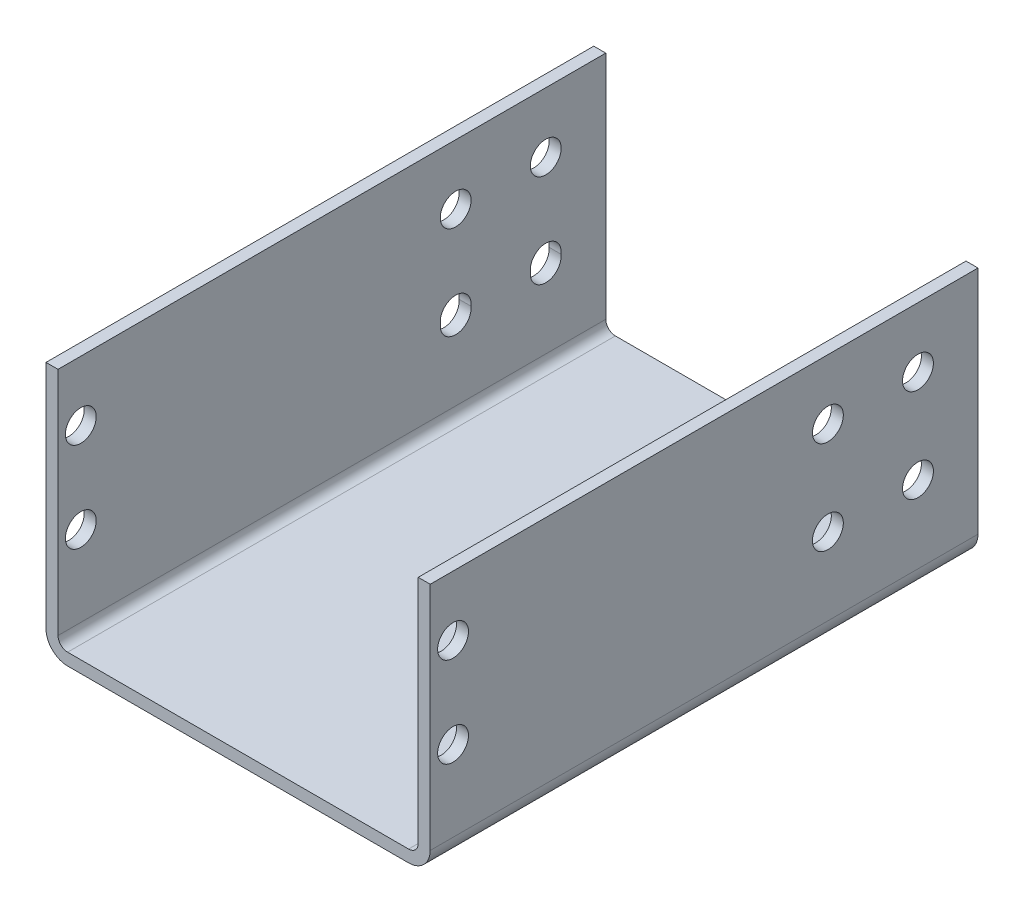
ISO-10303-21;
HEADER;
FILE_DESCRIPTION(('STEP AP214'),'2;1');
FILE_NAME('part.step','',(''),(''),'','','');
FILE_SCHEMA(('AUTOMOTIVE_DESIGN { 1 0 10303 214 1 1 1 1 }'));
ENDSEC;
DATA;
#1=APPLICATION_CONTEXT('core data for automotive mechanical design processes');
#2=APPLICATION_PROTOCOL_DEFINITION('international standard','automotive_design',2000,#1);
#3=PRODUCT_CONTEXT('',#1,'mechanical');
#4=PRODUCT('Part','Part','',(#3));
#5=PRODUCT_RELATED_PRODUCT_CATEGORY('part','',(#4));
#6=PRODUCT_DEFINITION_FORMATION('','',#4);
#7=PRODUCT_DEFINITION_CONTEXT('part definition',#1,'design');
#8=PRODUCT_DEFINITION('design','',#6,#7);
#9=PRODUCT_DEFINITION_SHAPE('','',#8);
#10=(LENGTH_UNIT() NAMED_UNIT(*) SI_UNIT(.MILLI.,.METRE.));
#11=(NAMED_UNIT(*) PLANE_ANGLE_UNIT() SI_UNIT($,.RADIAN.));
#12=(NAMED_UNIT(*) SI_UNIT($,.STERADIAN.) SOLID_ANGLE_UNIT());
#13=UNCERTAINTY_MEASURE_WITH_UNIT(LENGTH_MEASURE(1.E-05),#10,'distance_accuracy_value','');
#14=(GEOMETRIC_REPRESENTATION_CONTEXT(3) GLOBAL_UNCERTAINTY_ASSIGNED_CONTEXT((#13)) GLOBAL_UNIT_ASSIGNED_CONTEXT((#10,
#11,#12)) REPRESENTATION_CONTEXT('',''));
#15=CARTESIAN_POINT('',(0.,0.,0.));
#16=DIRECTION('',(0.,0.,1.));
#17=DIRECTION('',(1.,0.,0.));
#18=AXIS2_PLACEMENT_3D('',#15,#16,#17);
#19=CARTESIAN_POINT('',(-1.27,1.01600000000001,106.545154358872));
#20=DIRECTION('',(1.,0.,0.));
#21=DIRECTION('',(0.,0.,-1.));
#22=AXIS2_PLACEMENT_3D('',#19,#20,#21);
#23=PLANE('',#22);
#24=CARTESIAN_POINT('',(-1.27,19.0500000000006,55.5224999680006));
#25=DIRECTION('',(-1.,0.,0.));
#26=DIRECTION('',(0.,0.,1.));
#27=AXIS2_PLACEMENT_3D('',#24,#25,#26);
#28=CIRCLE('',#27,1.63194999999999);
#29=CARTESIAN_POINT('',(-1.27,19.0500000000006,57.1544499680006));
#30=VERTEX_POINT('',#29);
#31=EDGE_CURVE('E452',#30,#30,#28,.T.);
#32=ORIENTED_EDGE('',*,*,#31,.F.);
#33=EDGE_LOOP('',(#32));
#34=FACE_BOUND('',#33,.T.);
#35=CARTESIAN_POINT('',(-1.27,19.0500000000005,6.35000000000055));
#36=DIRECTION('',(-1.,0.,0.));
#37=DIRECTION('',(0.,0.,1.));
#38=AXIS2_PLACEMENT_3D('',#35,#36,#37);
#39=CIRCLE('',#38,1.63194999999999);
#40=CARTESIAN_POINT('',(-1.27,19.0500000000005,7.98195000000054));
#41=VERTEX_POINT('',#40);
#42=EDGE_CURVE('E285',#41,#41,#39,.T.);
#43=ORIENTED_EDGE('',*,*,#42,.F.);
#44=EDGE_LOOP('',(#43));
#45=FACE_BOUND('',#44,.T.);
#46=CARTESIAN_POINT('',(-1.27,19.0499999999993,15.8750000000001));
#47=DIRECTION('',(-1.,0.,0.));
#48=DIRECTION('',(0.,0.,1.));
#49=AXIS2_PLACEMENT_3D('',#46,#47,#48);
#50=CIRCLE('',#49,1.63194999999999);
#51=CARTESIAN_POINT('',(-1.27,19.0499999999993,17.50695));
#52=VERTEX_POINT('',#51);
#53=EDGE_CURVE('E166',#52,#52,#50,.T.);
#54=ORIENTED_EDGE('',*,*,#53,.F.);
#55=EDGE_LOOP('',(#54));
#56=FACE_BOUND('',#55,.T.);
#57=CARTESIAN_POINT('',(-1.27,9.52499999999934,15.8750000000002));
#58=DIRECTION('',(-1.,0.,0.));
#59=DIRECTION('',(0.,0.,1.));
#60=AXIS2_PLACEMENT_3D('',#57,#58,#59);
#61=CIRCLE('',#60,1.63194999999999);
#62=CARTESIAN_POINT('',(-1.27,9.34786065421082,17.4973077558448));
#63=VERTEX_POINT('',#62);
#64=CARTESIAN_POINT('',(-1.27,9.34786065421743,14.2526922441549));
#65=VERTEX_POINT('',#64);
#66=EDGE_CURVE('E156',#63,#65,#61,.T.);
#67=ORIENTED_EDGE('',*,*,#66,.F.);
#68=CARTESIAN_POINT('',(-1.27,9.17072130842898,15.8749999999995));
#69=DIRECTION('',(1.,0.,0.));
#70=DIRECTION('',(0.,0.,-1.));
#71=AXIS2_PLACEMENT_3D('',#68,#69,#70);
#72=CIRCLE('',#71,1.63194999999998);
#73=EDGE_CURVE('E146',#63,#65,#72,.T.);
#74=ORIENTED_EDGE('',*,*,#73,.T.);
#75=EDGE_LOOP('',(#67,#74));
#76=FACE_BOUND('',#75,.T.);
#77=CARTESIAN_POINT('',(-1.27,9.52499999999921,6.35000000000019));
#78=DIRECTION('',(-1.,0.,0.));
#79=DIRECTION('',(0.,0.,1.));
#80=AXIS2_PLACEMENT_3D('',#77,#78,#79);
#81=CIRCLE('',#80,1.63194999999999);
#82=CARTESIAN_POINT('',(-1.27,9.34786065421074,7.97230775584481));
#83=VERTEX_POINT('',#82);
#84=CARTESIAN_POINT('',(-1.27,9.34786065421736,4.72769224415485));
#85=VERTEX_POINT('',#84);
#86=EDGE_CURVE('E163',#83,#85,#81,.T.);
#87=ORIENTED_EDGE('',*,*,#86,.F.);
#88=CARTESIAN_POINT('',(-1.27,9.17072130842898,6.34999999999947));
#89=DIRECTION('',(1.,0.,0.));
#90=DIRECTION('',(0.,0.,-1.));
#91=AXIS2_PLACEMENT_3D('',#88,#89,#90);
#92=CIRCLE('',#91,1.63194999999998);
#93=EDGE_CURVE('E273',#83,#85,#92,.T.);
#94=ORIENTED_EDGE('',*,*,#93,.T.);
#95=EDGE_LOOP('',(#87,#94));
#96=FACE_BOUND('',#95,.T.);
#97=DIRECTION('',(0.,0.,-1.));
#98=VECTOR('',#97,1.);
#99=CARTESIAN_POINT('',(-1.27,1.01600000000002,106.545154358872));
#100=LINE('',#99,#98);
#101=CARTESIAN_POINT('',(-1.27,1.016,57.9354999680001));
#102=VERTEX_POINT('',#101);
#103=CARTESIAN_POINT('',(-1.27,1.01600000000002,0.));
#104=VERTEX_POINT('',#103);
#105=EDGE_CURVE('E245',#102,#104,#100,.T.);
#106=ORIENTED_EDGE('',*,*,#105,.F.);
#107=DIRECTION('',(0.,1.,0.));
#108=VECTOR('',#107,1.);
#109=CARTESIAN_POINT('',(-1.27,1.01599999999996,57.9354999680001));
#110=LINE('',#109,#108);
#111=CARTESIAN_POINT('',(-1.27,25.4,57.935499968));
#112=VERTEX_POINT('',#111);
#113=EDGE_CURVE('E183',#102,#112,#110,.T.);
#114=ORIENTED_EDGE('',*,*,#113,.T.);
#115=DIRECTION('',(0.,0.,-1.));
#116=VECTOR('',#115,1.);
#117=CARTESIAN_POINT('',(-1.27,25.4,106.545154358872));
#118=LINE('',#117,#116);
#119=CARTESIAN_POINT('',(-1.27,25.4,0.));
#120=VERTEX_POINT('',#119);
#121=EDGE_CURVE('E247',#112,#120,#118,.T.);
#122=ORIENTED_EDGE('',*,*,#121,.T.);
#123=DIRECTION('',(0.,1.,0.));
#124=VECTOR('',#123,1.);
#125=CARTESIAN_POINT('',(-1.27,1.01600000000001,0.));
#126=LINE('',#125,#124);
#127=EDGE_CURVE('E227',#120,#104,#126,.F.);
#128=ORIENTED_EDGE('',*,*,#127,.T.);
#129=EDGE_LOOP('',(#106,#114,#122,#128));
#130=FACE_BOUND('',#129,.T.);
#131=CARTESIAN_POINT('',(-1.27,9.52499999999995,55.5224999680002));
#132=DIRECTION('',(-1.,0.,0.));
#133=DIRECTION('',(0.,0.,1.));
#134=AXIS2_PLACEMENT_3D('',#131,#132,#133);
#135=CIRCLE('',#134,1.63194999999999);
#136=CARTESIAN_POINT('',(-1.27,9.52499999999995,57.1544499680002));
#137=VERTEX_POINT('',#136);
#138=EDGE_CURVE('E458',#137,#137,#135,.T.);
#139=ORIENTED_EDGE('',*,*,#138,.F.);
#140=EDGE_LOOP('',(#139));
#141=FACE_BOUND('',#140,.T.);
#142=ADVANCED_FACE('F33',(#34,#45,#56,#76,#96,#130,#141),#23,.F.);
#143=CARTESIAN_POINT('',(39.37,1.01600000000001,106.545154358872));
#144=DIRECTION('',(-1.,0.,0.));
#145=DIRECTION('',(0.,-1.,0.));
#146=AXIS2_PLACEMENT_3D('',#143,#144,#145);
#147=PLANE('',#146);
#148=CARTESIAN_POINT('',(39.3700000000009,9.52500000000058,55.5224999680002));
#149=DIRECTION('',(1.,0.,0.));
#150=DIRECTION('',(0.,0.,-1.));
#151=AXIS2_PLACEMENT_3D('',#148,#149,#150);
#152=CIRCLE('',#151,1.63194999999999);
#153=CARTESIAN_POINT('',(39.3700000000009,9.52500000000058,53.8905499680002));
#154=VERTEX_POINT('',#153);
#155=EDGE_CURVE('E442',#154,#154,#152,.T.);
#156=ORIENTED_EDGE('',*,*,#155,.F.);
#157=EDGE_LOOP('',(#156));
#158=FACE_BOUND('',#157,.T.);
#159=CARTESIAN_POINT('',(39.3700000000009,19.0500000000006,55.5224999679997));
#160=DIRECTION('',(1.,0.,0.));
#161=DIRECTION('',(0.,0.,-1.));
#162=AXIS2_PLACEMENT_3D('',#159,#160,#161);
#163=CIRCLE('',#162,1.63194999999999);
#164=CARTESIAN_POINT('',(39.3700000000009,19.0500000000006,53.8905499679997));
#165=VERTEX_POINT('',#164);
#166=EDGE_CURVE('E444',#165,#165,#163,.T.);
#167=ORIENTED_EDGE('',*,*,#166,.F.);
#168=EDGE_LOOP('',(#167));
#169=FACE_BOUND('',#168,.T.);
#170=CARTESIAN_POINT('',(39.3700000000009,19.0500000000006,6.34999999999947));
#171=DIRECTION('',(1.,0.,0.));
#172=DIRECTION('',(0.,0.,-1.));
#173=AXIS2_PLACEMENT_3D('',#170,#171,#172);
#174=CIRCLE('',#173,1.63194999999999);
#175=CARTESIAN_POINT('',(39.3700000000009,19.0500000000006,4.71804999999948));
#176=VERTEX_POINT('',#175);
#177=EDGE_CURVE('E464',#176,#176,#174,.T.);
#178=ORIENTED_EDGE('',*,*,#177,.F.);
#179=EDGE_LOOP('',(#178));
#180=FACE_BOUND('',#179,.T.);
#181=CARTESIAN_POINT('',(39.3700000000009,19.0500000000006,15.8749999999995));
#182=DIRECTION('',(1.,0.,0.));
#183=DIRECTION('',(0.,0.,-1.));
#184=AXIS2_PLACEMENT_3D('',#181,#182,#183);
#185=CIRCLE('',#184,1.63194999999999);
#186=CARTESIAN_POINT('',(39.3700000000009,19.0500000000006,14.2430499999995));
#187=VERTEX_POINT('',#186);
#188=EDGE_CURVE('E470',#187,#187,#185,.T.);
#189=ORIENTED_EDGE('',*,*,#188,.F.);
#190=EDGE_LOOP('',(#189));
#191=FACE_BOUND('',#190,.T.);
#192=CARTESIAN_POINT('',(39.3700000000009,9.17072130842898,15.8749999999995));
#193=DIRECTION('',(1.,0.,0.));
#194=DIRECTION('',(0.,0.,-1.));
#195=AXIS2_PLACEMENT_3D('',#192,#193,#194);
#196=CIRCLE('',#195,1.63194999999999);
#197=CARTESIAN_POINT('',(39.3700000000009,9.17072130842898,14.2430499999995));
#198=VERTEX_POINT('',#197);
#199=EDGE_CURVE('E157',#198,#198,#196,.T.);
#200=ORIENTED_EDGE('',*,*,#199,.F.);
#201=EDGE_LOOP('',(#200));
#202=FACE_BOUND('',#201,.T.);
#203=DIRECTION('',(0.,0.,-1.));
#204=VECTOR('',#203,1.);
#205=CARTESIAN_POINT('',(39.37,25.4,106.545154358872));
#206=LINE('',#205,#204);
#207=CARTESIAN_POINT('',(39.37,25.4,57.935499968));
#208=VERTEX_POINT('',#207);
#209=CARTESIAN_POINT('',(39.37,25.4,0.));
#210=VERTEX_POINT('',#209);
#211=EDGE_CURVE('E261',#208,#210,#206,.T.);
#212=ORIENTED_EDGE('',*,*,#211,.F.);
#213=DIRECTION('',(0.,-1.,0.));
#214=VECTOR('',#213,1.);
#215=CARTESIAN_POINT('',(39.37,1.01599999999996,57.935499968));
#216=LINE('',#215,#214);
#217=CARTESIAN_POINT('',(39.37,1.01600000000001,57.935499968));
#218=VERTEX_POINT('',#217);
#219=EDGE_CURVE('E200',#208,#218,#216,.T.);
#220=ORIENTED_EDGE('',*,*,#219,.T.);
#221=DIRECTION('',(0.,0.,-1.));
#222=VECTOR('',#221,1.);
#223=CARTESIAN_POINT('',(39.37,1.01600000000001,106.545154358872));
#224=LINE('',#223,#222);
#225=CARTESIAN_POINT('',(39.37,1.01600000000001,0.));
#226=VERTEX_POINT('',#225);
#227=EDGE_CURVE('E239',#218,#226,#224,.T.);
#228=ORIENTED_EDGE('',*,*,#227,.T.);
#229=DIRECTION('',(0.,1.,0.));
#230=VECTOR('',#229,1.);
#231=CARTESIAN_POINT('',(39.37,1.01600000000001,0.));
#232=LINE('',#231,#230);
#233=EDGE_CURVE('E175',#226,#210,#232,.T.);
#234=ORIENTED_EDGE('',*,*,#233,.T.);
#235=EDGE_LOOP('',(#212,#220,#228,#234));
#236=FACE_BOUND('',#235,.T.);
#237=CARTESIAN_POINT('',(39.3700000000009,9.17072130842898,6.34999999999947));
#238=DIRECTION('',(1.,0.,0.));
#239=DIRECTION('',(0.,0.,-1.));
#240=AXIS2_PLACEMENT_3D('',#237,#238,#239);
#241=CIRCLE('',#240,1.63194999999999);
#242=CARTESIAN_POINT('',(39.3700000000009,9.17072130842898,4.71804999999948));
#243=VERTEX_POINT('',#242);
#244=EDGE_CURVE('E274',#243,#243,#241,.T.);
#245=ORIENTED_EDGE('',*,*,#244,.F.);
#246=EDGE_LOOP('',(#245));
#247=FACE_BOUND('',#246,.T.);
#248=ADVANCED_FACE('F35',(#158,#169,#180,#191,#202,#236,#247),#147,.F.);
#249=CARTESIAN_POINT('',(37.084,1.016,0.));
#250=DIRECTION('',(0.,0.,1.));
#251=DIRECTION('',(1.,0.,0.));
#252=AXIS2_PLACEMENT_3D('',#249,#250,#251);
#253=PLANE('',#252);
#254=ORIENTED_EDGE('',*,*,#233,.F.);
#255=CARTESIAN_POINT('',(37.084,1.016,0.));
#256=DIRECTION('',(0.,0.,1.));
#257=DIRECTION('',(1.,0.,0.));
#258=AXIS2_PLACEMENT_3D('',#255,#256,#257);
#259=CIRCLE('',#258,2.286);
#260=CARTESIAN_POINT('',(37.084,-1.27,0.));
#261=VERTEX_POINT('',#260);
#262=EDGE_CURVE('E236',#261,#226,#259,.T.);
#263=ORIENTED_EDGE('',*,*,#262,.F.);
#264=DIRECTION('',(1.,0.,0.));
#265=VECTOR('',#264,1.);
#266=CARTESIAN_POINT('',(1.01600000000001,-1.27,0.));
#267=LINE('',#266,#265);
#268=CARTESIAN_POINT('',(1.01600000000001,-1.27,0.));
#269=VERTEX_POINT('',#268);
#270=EDGE_CURVE('E233',#269,#261,#267,.T.);
#271=ORIENTED_EDGE('',*,*,#270,.F.);
#272=CARTESIAN_POINT('',(1.016,1.016,0.));
#273=DIRECTION('',(0.,0.,1.));
#274=DIRECTION('',(1.,0.,0.));
#275=AXIS2_PLACEMENT_3D('',#272,#273,#274);
#276=CIRCLE('',#275,2.286);
#277=EDGE_CURVE('E230',#104,#269,#276,.T.);
#278=ORIENTED_EDGE('',*,*,#277,.F.);
#279=ORIENTED_EDGE('',*,*,#127,.F.);
#280=DIRECTION('',(1.,0.,0.));
#281=VECTOR('',#280,1.);
#282=CARTESIAN_POINT('',(-1.27,25.4,0.));
#283=LINE('',#282,#281);
#284=CARTESIAN_POINT('',(0.,25.4,0.));
#285=VERTEX_POINT('',#284);
#286=EDGE_CURVE('E224',#120,#285,#283,.T.);
#287=ORIENTED_EDGE('',*,*,#286,.T.);
#288=DIRECTION('',(0.,-1.,0.));
#289=VECTOR('',#288,1.);
#290=CARTESIAN_POINT('',(0.,1.01600000000001,0.));
#291=LINE('',#290,#289);
#292=CARTESIAN_POINT('',(0.,1.01600000000001,0.));
#293=VERTEX_POINT('',#292);
#294=EDGE_CURVE('E221',#285,#293,#291,.T.);
#295=ORIENTED_EDGE('',*,*,#294,.T.);
#296=CARTESIAN_POINT('',(1.016,1.016,0.));
#297=DIRECTION('',(0.,0.,1.));
#298=DIRECTION('',(1.,0.,0.));
#299=AXIS2_PLACEMENT_3D('',#296,#297,#298);
#300=CIRCLE('',#299,1.016);
#301=CARTESIAN_POINT('',(1.01600000000001,0.,0.));
#302=VERTEX_POINT('',#301);
#303=EDGE_CURVE('E218',#293,#302,#300,.T.);
#304=ORIENTED_EDGE('',*,*,#303,.T.);
#305=DIRECTION('',(1.,0.,0.));
#306=VECTOR('',#305,1.);
#307=CARTESIAN_POINT('',(1.01600000000001,0.,0.));
#308=LINE('',#307,#306);
#309=CARTESIAN_POINT('',(37.084,0.,0.));
#310=VERTEX_POINT('',#309);
#311=EDGE_CURVE('E215',#302,#310,#308,.T.);
#312=ORIENTED_EDGE('',*,*,#311,.T.);
#313=CARTESIAN_POINT('',(37.084,1.016,0.));
#314=DIRECTION('',(0.,0.,1.));
#315=DIRECTION('',(-1.,0.,0.));
#316=AXIS2_PLACEMENT_3D('',#313,#314,#315);
#317=CIRCLE('',#316,1.016);
#318=CARTESIAN_POINT('',(38.1,1.01600000000001,0.));
#319=VERTEX_POINT('',#318);
#320=EDGE_CURVE('E212',#310,#319,#317,.T.);
#321=ORIENTED_EDGE('',*,*,#320,.T.);
#322=DIRECTION('',(0.,1.,0.));
#323=VECTOR('',#322,1.);
#324=CARTESIAN_POINT('',(38.1,1.01600000000001,0.));
#325=LINE('',#324,#323);
#326=CARTESIAN_POINT('',(38.1,25.4,0.));
#327=VERTEX_POINT('',#326);
#328=EDGE_CURVE('E209',#319,#327,#325,.T.);
#329=ORIENTED_EDGE('',*,*,#328,.T.);
#330=DIRECTION('',(1.,0.,0.));
#331=VECTOR('',#330,1.);
#332=CARTESIAN_POINT('',(38.1,25.4,0.));
#333=LINE('',#332,#331);
#334=EDGE_CURVE('E206',#327,#210,#333,.T.);
#335=ORIENTED_EDGE('',*,*,#334,.T.);
#336=EDGE_LOOP('',(#254,#263,#271,#278,#279,#287,#295,#304,#312,#321,#329,#335));
#337=FACE_BOUND('',#336,.T.);
#338=ADVANCED_FACE('F301',(#337),#253,.F.);
#339=CARTESIAN_POINT('',(37.084,1.016,106.545154358872));
#340=DIRECTION('',(0.,0.,-1.));
#341=DIRECTION('',(-1.,0.,0.));
#342=AXIS2_PLACEMENT_3D('',#339,#340,#341);
#343=CYLINDRICAL_SURFACE('',#342,2.286);
#344=ORIENTED_EDGE('',*,*,#227,.F.);
#345=CARTESIAN_POINT('',(37.084,1.016,57.935499968));
#346=DIRECTION('',(0.,0.,-1.));
#347=DIRECTION('',(-1.,0.,0.));
#348=AXIS2_PLACEMENT_3D('',#345,#346,#347);
#349=CIRCLE('',#348,2.286);
#350=CARTESIAN_POINT('',(37.084,-1.27,57.935499968));
#351=VERTEX_POINT('',#350);
#352=EDGE_CURVE('E180',#218,#351,#349,.T.);
#353=ORIENTED_EDGE('',*,*,#352,.T.);
#354=DIRECTION('',(0.,0.,-1.));
#355=VECTOR('',#354,1.);
#356=CARTESIAN_POINT('',(37.084,-1.27,106.545154358872));
#357=LINE('',#356,#355);
#358=EDGE_CURVE('E241',#351,#261,#357,.T.);
#359=ORIENTED_EDGE('',*,*,#358,.T.);
#360=ORIENTED_EDGE('',*,*,#262,.T.);
#361=EDGE_LOOP('',(#344,#353,#359,#360));
#362=FACE_BOUND('',#361,.T.);
#363=ADVANCED_FACE('F382',(#362),#343,.T.);
#364=CARTESIAN_POINT('',(1.01600000000001,-1.27,106.545154358872));
#365=DIRECTION('',(0.,1.,0.));
#366=DIRECTION('',(0.,0.,1.));
#367=AXIS2_PLACEMENT_3D('',#364,#365,#366);
#368=PLANE('',#367);
#369=ORIENTED_EDGE('',*,*,#358,.F.);
#370=DIRECTION('',(-1.,0.,0.));
#371=VECTOR('',#370,1.);
#372=CARTESIAN_POINT('',(1.01599999999995,-1.27,57.9354999680001));
#373=LINE('',#372,#371);
#374=CARTESIAN_POINT('',(1.01600000000001,-1.27,57.9354999680001));
#375=VERTEX_POINT('',#374);
#376=EDGE_CURVE('E176',#351,#375,#373,.T.);
#377=ORIENTED_EDGE('',*,*,#376,.T.);
#378=DIRECTION('',(0.,0.,-1.));
#379=VECTOR('',#378,1.);
#380=CARTESIAN_POINT('',(1.01600000000001,-1.27,106.545154358872));
#381=LINE('',#380,#379);
#382=EDGE_CURVE('E243',#375,#269,#381,.T.);
#383=ORIENTED_EDGE('',*,*,#382,.T.);
#384=ORIENTED_EDGE('',*,*,#270,.T.);
#385=EDGE_LOOP('',(#369,#377,#383,#384));
#386=FACE_BOUND('',#385,.T.);
#387=ADVANCED_FACE('F379',(#386),#368,.F.);
#388=CARTESIAN_POINT('',(1.016,1.016,106.545154358872));
#389=DIRECTION('',(0.,0.,-1.));
#390=DIRECTION('',(-1.,0.,0.));
#391=AXIS2_PLACEMENT_3D('',#388,#389,#390);
#392=CYLINDRICAL_SURFACE('',#391,2.286);
#393=ORIENTED_EDGE('',*,*,#382,.F.);
#394=CARTESIAN_POINT('',(1.016,1.016,57.9354999680001));
#395=DIRECTION('',(0.,0.,-1.));
#396=DIRECTION('',(-1.,0.,0.));
#397=AXIS2_PLACEMENT_3D('',#394,#395,#396);
#398=CIRCLE('',#397,2.286);
#399=EDGE_CURVE('E179',#375,#102,#398,.T.);
#400=ORIENTED_EDGE('',*,*,#399,.T.);
#401=ORIENTED_EDGE('',*,*,#105,.T.);
#402=ORIENTED_EDGE('',*,*,#277,.T.);
#403=EDGE_LOOP('',(#393,#400,#401,#402));
#404=FACE_BOUND('',#403,.T.);
#405=ADVANCED_FACE('F307',(#404),#392,.T.);
#406=CARTESIAN_POINT('',(-1.27,25.4,106.545154358872));
#407=DIRECTION('',(0.,1.,0.));
#408=DIRECTION('',(0.,0.,1.));
#409=AXIS2_PLACEMENT_3D('',#406,#407,#408);
#410=PLANE('',#409);
#411=DIRECTION('',(-1.,0.,0.));
#412=VECTOR('',#411,1.);
#413=CARTESIAN_POINT('',(-1.27000000000006,25.4,57.935499968));
#414=LINE('',#413,#412);
#415=CARTESIAN_POINT('',(0.,25.4,57.935499968));
#416=VERTEX_POINT('',#415);
#417=EDGE_CURVE('E186',#416,#112,#414,.T.);
#418=ORIENTED_EDGE('',*,*,#417,.F.);
#419=DIRECTION('',(0.,0.,-1.));
#420=VECTOR('',#419,1.);
#421=CARTESIAN_POINT('',(0.,25.4,106.545154358872));
#422=LINE('',#421,#420);
#423=EDGE_CURVE('E249',#416,#285,#422,.T.);
#424=ORIENTED_EDGE('',*,*,#423,.T.);
#425=ORIENTED_EDGE('',*,*,#286,.F.);
#426=ORIENTED_EDGE('',*,*,#121,.F.);
#427=EDGE_LOOP('',(#418,#424,#425,#426));
#428=FACE_BOUND('',#427,.T.);
#429=ADVANCED_FACE('F309',(#428),#410,.T.);
#430=CARTESIAN_POINT('',(0.,1.01600000000001,106.545154358872));
#431=DIRECTION('',(1.,0.,0.));
#432=DIRECTION('',(0.,0.,-1.));
#433=AXIS2_PLACEMENT_3D('',#430,#431,#432);
#434=PLANE('',#433);
#435=CARTESIAN_POINT('',(0.,19.0500000000006,55.5224999680006));
#436=DIRECTION('',(-1.,0.,0.));
#437=DIRECTION('',(0.,0.,1.));
#438=AXIS2_PLACEMENT_3D('',#435,#436,#437);
#439=CIRCLE('',#438,1.63195);
#440=CARTESIAN_POINT('',(0.,19.0500000000006,57.1544499680006));
#441=VERTEX_POINT('',#440);
#442=EDGE_CURVE('E455',#441,#441,#439,.T.);
#443=ORIENTED_EDGE('',*,*,#442,.T.);
#444=EDGE_LOOP('',(#443));
#445=FACE_BOUND('',#444,.T.);
#446=CARTESIAN_POINT('',(0.,9.52499999999995,55.5224999680002));
#447=DIRECTION('',(-1.,0.,0.));
#448=DIRECTION('',(0.,0.,1.));
#449=AXIS2_PLACEMENT_3D('',#446,#447,#448);
#450=CIRCLE('',#449,1.63195);
#451=CARTESIAN_POINT('',(0.,9.52499999999995,57.1544499680002));
#452=VERTEX_POINT('',#451);
#453=EDGE_CURVE('E461',#452,#452,#450,.T.);
#454=ORIENTED_EDGE('',*,*,#453,.T.);
#455=EDGE_LOOP('',(#454));
#456=FACE_BOUND('',#455,.T.);
#457=CARTESIAN_POINT('',(0.,9.17072130842898,15.8749999999995));
#458=DIRECTION('',(1.,0.,0.));
#459=DIRECTION('',(0.,0.,-1.));
#460=AXIS2_PLACEMENT_3D('',#457,#458,#459);
#461=CIRCLE('',#460,1.63194999999999);
#462=CARTESIAN_POINT('',(0.,9.34786065421079,17.4973077558448));
#463=VERTEX_POINT('',#462);
#464=CARTESIAN_POINT('',(0.,9.34786065421743,14.2526922441549));
#465=VERTEX_POINT('',#464);
#466=EDGE_CURVE('E49',#463,#465,#461,.T.);
#467=ORIENTED_EDGE('',*,*,#466,.F.);
#468=CARTESIAN_POINT('',(0.,9.52499999999934,15.8750000000002));
#469=DIRECTION('',(-1.,0.,0.));
#470=DIRECTION('',(0.,0.,1.));
#471=AXIS2_PLACEMENT_3D('',#468,#469,#470);
#472=CIRCLE('',#471,1.63195);
#473=EDGE_CURVE('E160',#463,#465,#472,.T.);
#474=ORIENTED_EDGE('',*,*,#473,.T.);
#475=EDGE_LOOP('',(#467,#474));
#476=FACE_BOUND('',#475,.T.);
#477=CARTESIAN_POINT('',(0.,9.17072130842898,6.34999999999947));
#478=DIRECTION('',(1.,0.,0.));
#479=DIRECTION('',(0.,0.,-1.));
#480=AXIS2_PLACEMENT_3D('',#477,#478,#479);
#481=CIRCLE('',#480,1.63194999999999);
#482=CARTESIAN_POINT('',(0.,9.34786065421072,7.97230775584481));
#483=VERTEX_POINT('',#482);
#484=CARTESIAN_POINT('',(0.,9.34786065421736,4.72769224415484));
#485=VERTEX_POINT('',#484);
#486=EDGE_CURVE('E57',#483,#485,#481,.T.);
#487=ORIENTED_EDGE('',*,*,#486,.F.);
#488=CARTESIAN_POINT('',(0.,9.52499999999921,6.35000000000019));
#489=DIRECTION('',(-1.,0.,0.));
#490=DIRECTION('',(0.,0.,1.));
#491=AXIS2_PLACEMENT_3D('',#488,#489,#490);
#492=CIRCLE('',#491,1.63195);
#493=EDGE_CURVE('E172',#483,#485,#492,.T.);
#494=ORIENTED_EDGE('',*,*,#493,.T.);
#495=EDGE_LOOP('',(#487,#494));
#496=FACE_BOUND('',#495,.T.);
#497=CARTESIAN_POINT('',(0.,19.0500000000005,6.35000000000055));
#498=DIRECTION('',(-1.,0.,0.));
#499=DIRECTION('',(0.,0.,1.));
#500=AXIS2_PLACEMENT_3D('',#497,#498,#499);
#501=CIRCLE('',#500,1.63195);
#502=CARTESIAN_POINT('',(0.,19.0500000000005,7.98195000000055));
#503=VERTEX_POINT('',#502);
#504=EDGE_CURVE('E288',#503,#503,#501,.T.);
#505=ORIENTED_EDGE('',*,*,#504,.T.);
#506=EDGE_LOOP('',(#505));
#507=FACE_BOUND('',#506,.T.);
#508=CARTESIAN_POINT('',(0.,19.0499999999993,15.8750000000001));
#509=DIRECTION('',(-1.,0.,0.));
#510=DIRECTION('',(0.,0.,1.));
#511=AXIS2_PLACEMENT_3D('',#508,#509,#510);
#512=CIRCLE('',#511,1.63195);
#513=CARTESIAN_POINT('',(0.,19.0499999999993,17.5069500000001));
#514=VERTEX_POINT('',#513);
#515=EDGE_CURVE('E161',#514,#514,#512,.T.);
#516=ORIENTED_EDGE('',*,*,#515,.T.);
#517=EDGE_LOOP('',(#516));
#518=FACE_BOUND('',#517,.T.);
#519=DIRECTION('',(0.,1.,0.));
#520=VECTOR('',#519,1.);
#521=CARTESIAN_POINT('',(0.,1.01599999999996,57.9354999680001));
#522=LINE('',#521,#520);
#523=CARTESIAN_POINT('',(0.,1.01600000000001,57.9354999680001));
#524=VERTEX_POINT('',#523);
#525=EDGE_CURVE('E188',#524,#416,#522,.T.);
#526=ORIENTED_EDGE('',*,*,#525,.F.);
#527=DIRECTION('',(0.,0.,-1.));
#528=VECTOR('',#527,1.);
#529=CARTESIAN_POINT('',(0.,1.01600000000001,106.545154358872));
#530=LINE('',#529,#528);
#531=EDGE_CURVE('E251',#524,#293,#530,.T.);
#532=ORIENTED_EDGE('',*,*,#531,.T.);
#533=ORIENTED_EDGE('',*,*,#294,.F.);
#534=ORIENTED_EDGE('',*,*,#423,.F.);
#535=EDGE_LOOP('',(#526,#532,#533,#534));
#536=FACE_BOUND('',#535,.T.);
#537=ADVANCED_FACE('F312',(#445,#456,#476,#496,#507,#518,#536),#434,.T.);
#538=CARTESIAN_POINT('',(1.016,1.016,106.545154358872));
#539=DIRECTION('',(0.,0.,-1.));
#540=DIRECTION('',(-1.,0.,0.));
#541=AXIS2_PLACEMENT_3D('',#538,#539,#540);
#542=CYLINDRICAL_SURFACE('',#541,1.016);
#543=CARTESIAN_POINT('',(1.016,1.016,57.9354999680001));
#544=DIRECTION('',(0.,0.,-1.));
#545=DIRECTION('',(-1.,0.,0.));
#546=AXIS2_PLACEMENT_3D('',#543,#544,#545);
#547=CIRCLE('',#546,1.016);
#548=CARTESIAN_POINT('',(1.01600000000001,0.,57.9354999680001));
#549=VERTEX_POINT('',#548);
#550=EDGE_CURVE('E190',#549,#524,#547,.T.);
#551=ORIENTED_EDGE('',*,*,#550,.F.);
#552=DIRECTION('',(0.,0.,-1.));
#553=VECTOR('',#552,1.);
#554=CARTESIAN_POINT('',(1.01600000000001,0.,106.545154358872));
#555=LINE('',#554,#553);
#556=EDGE_CURVE('E253',#549,#302,#555,.T.);
#557=ORIENTED_EDGE('',*,*,#556,.T.);
#558=ORIENTED_EDGE('',*,*,#303,.F.);
#559=ORIENTED_EDGE('',*,*,#531,.F.);
#560=EDGE_LOOP('',(#551,#557,#558,#559));
#561=FACE_BOUND('',#560,.T.);
#562=ADVANCED_FACE('F316',(#561),#542,.F.);
#563=CARTESIAN_POINT('',(1.01600000000001,0.,106.545154358872));
#564=DIRECTION('',(0.,1.,0.));
#565=DIRECTION('',(0.,0.,1.));
#566=AXIS2_PLACEMENT_3D('',#563,#564,#565);
#567=PLANE('',#566);
#568=DIRECTION('',(-1.,0.,0.));
#569=VECTOR('',#568,1.);
#570=CARTESIAN_POINT('',(1.01599999999995,0.,57.9354999680001));
#571=LINE('',#570,#569);
#572=CARTESIAN_POINT('',(37.084,0.,57.935499968));
#573=VERTEX_POINT('',#572);
#574=EDGE_CURVE('E192',#573,#549,#571,.T.);
#575=ORIENTED_EDGE('',*,*,#574,.F.);
#576=DIRECTION('',(0.,0.,-1.));
#577=VECTOR('',#576,1.);
#578=CARTESIAN_POINT('',(37.084,0.,106.545154358872));
#579=LINE('',#578,#577);
#580=EDGE_CURVE('E255',#573,#310,#579,.T.);
#581=ORIENTED_EDGE('',*,*,#580,.T.);
#582=ORIENTED_EDGE('',*,*,#311,.F.);
#583=ORIENTED_EDGE('',*,*,#556,.F.);
#584=EDGE_LOOP('',(#575,#581,#582,#583));
#585=FACE_BOUND('',#584,.T.);
#586=ADVANCED_FACE('F320',(#585),#567,.T.);
#587=CARTESIAN_POINT('',(37.084,1.016,106.545154358872));
#588=DIRECTION('',(0.,0.,-1.));
#589=DIRECTION('',(-1.,0.,0.));
#590=AXIS2_PLACEMENT_3D('',#587,#588,#589);
#591=CYLINDRICAL_SURFACE('',#590,1.016);
#592=CARTESIAN_POINT('',(37.084,1.016,57.935499968));
#593=DIRECTION('',(0.,0.,-1.));
#594=DIRECTION('',(-1.,0.,0.));
#595=AXIS2_PLACEMENT_3D('',#592,#593,#594);
#596=CIRCLE('',#595,1.016);
#597=CARTESIAN_POINT('',(38.1,1.01600000000001,57.935499968));
#598=VERTEX_POINT('',#597);
#599=EDGE_CURVE('E194',#598,#573,#596,.T.);
#600=ORIENTED_EDGE('',*,*,#599,.F.);
#601=DIRECTION('',(0.,0.,-1.));
#602=VECTOR('',#601,1.);
#603=CARTESIAN_POINT('',(38.1,1.01600000000001,106.545154358872));
#604=LINE('',#603,#602);
#605=EDGE_CURVE('E257',#598,#319,#604,.T.);
#606=ORIENTED_EDGE('',*,*,#605,.T.);
#607=ORIENTED_EDGE('',*,*,#320,.F.);
#608=ORIENTED_EDGE('',*,*,#580,.F.);
#609=EDGE_LOOP('',(#600,#606,#607,#608));
#610=FACE_BOUND('',#609,.T.);
#611=ADVANCED_FACE('F324',(#610),#591,.F.);
#612=CARTESIAN_POINT('',(38.1,1.01600000000001,106.545154358872));
#613=DIRECTION('',(-1.,0.,0.));
#614=DIRECTION('',(0.,-1.,0.));
#615=AXIS2_PLACEMENT_3D('',#612,#613,#614);
#616=PLANE('',#615);
#617=CARTESIAN_POINT('',(38.1,9.52500000000058,55.5224999680002));
#618=DIRECTION('',(-1.,0.,0.));
#619=DIRECTION('',(0.,-1.,0.));
#620=AXIS2_PLACEMENT_3D('',#617,#618,#619);
#621=CIRCLE('',#620,1.63194999999999);
#622=CARTESIAN_POINT('',(38.1,7.8930500000006,55.5224999680002));
#623=VERTEX_POINT('',#622);
#624=EDGE_CURVE('E439',#623,#623,#621,.T.);
#625=ORIENTED_EDGE('',*,*,#624,.F.);
#626=EDGE_LOOP('',(#625));
#627=FACE_BOUND('',#626,.T.);
#628=CARTESIAN_POINT('',(38.1,19.0500000000006,55.5224999679997));
#629=DIRECTION('',(-1.,0.,0.));
#630=DIRECTION('',(0.,-1.,0.));
#631=AXIS2_PLACEMENT_3D('',#628,#629,#630);
#632=CIRCLE('',#631,1.63194999999998);
#633=CARTESIAN_POINT('',(38.1,17.4180500000006,55.5224999679997));
#634=VERTEX_POINT('',#633);
#635=EDGE_CURVE('E449',#634,#634,#632,.T.);
#636=ORIENTED_EDGE('',*,*,#635,.F.);
#637=EDGE_LOOP('',(#636));
#638=FACE_BOUND('',#637,.T.);
#639=CARTESIAN_POINT('',(38.1,19.0500000000006,6.34999999999947));
#640=DIRECTION('',(-1.,0.,0.));
#641=DIRECTION('',(0.,-1.,0.));
#642=AXIS2_PLACEMENT_3D('',#639,#640,#641);
#643=CIRCLE('',#642,1.63194999999998);
#644=CARTESIAN_POINT('',(38.1,17.4180500000006,6.34999999999947));
#645=VERTEX_POINT('',#644);
#646=EDGE_CURVE('E467',#645,#645,#643,.T.);
#647=ORIENTED_EDGE('',*,*,#646,.F.);
#648=EDGE_LOOP('',(#647));
#649=FACE_BOUND('',#648,.T.);
#650=CARTESIAN_POINT('',(38.1,19.0500000000006,15.8749999999995));
#651=DIRECTION('',(-1.,0.,0.));
#652=DIRECTION('',(0.,-1.,0.));
#653=AXIS2_PLACEMENT_3D('',#650,#651,#652);
#654=CIRCLE('',#653,1.63194999999998);
#655=CARTESIAN_POINT('',(38.1,17.4180500000006,15.8749999999995));
#656=VERTEX_POINT('',#655);
#657=EDGE_CURVE('E37',#656,#656,#654,.T.);
#658=ORIENTED_EDGE('',*,*,#657,.F.);
#659=EDGE_LOOP('',(#658));
#660=FACE_BOUND('',#659,.T.);
#661=CARTESIAN_POINT('',(38.1,9.17072130842898,15.8749999999995));
#662=DIRECTION('',(-1.,0.,0.));
#663=DIRECTION('',(0.,-1.,0.));
#664=AXIS2_PLACEMENT_3D('',#661,#662,#663);
#665=CIRCLE('',#664,1.63194999999999);
#666=CARTESIAN_POINT('',(38.1,7.53877130842899,15.8749999999995));
#667=VERTEX_POINT('',#666);
#668=EDGE_CURVE('E279',#667,#667,#665,.T.);
#669=ORIENTED_EDGE('',*,*,#668,.F.);
#670=EDGE_LOOP('',(#669));
#671=FACE_BOUND('',#670,.T.);
#672=CARTESIAN_POINT('',(38.1,9.17072130842898,6.34999999999947));
#673=DIRECTION('',(-1.,0.,0.));
#674=DIRECTION('',(0.,-1.,0.));
#675=AXIS2_PLACEMENT_3D('',#672,#673,#674);
#676=CIRCLE('',#675,1.63194999999999);
#677=CARTESIAN_POINT('',(38.1,7.53877130842899,6.34999999999947));
#678=VERTEX_POINT('',#677);
#679=EDGE_CURVE('E276',#678,#678,#676,.T.);
#680=ORIENTED_EDGE('',*,*,#679,.F.);
#681=EDGE_LOOP('',(#680));
#682=FACE_BOUND('',#681,.T.);
#683=DIRECTION('',(0.,-1.,0.));
#684=VECTOR('',#683,1.);
#685=CARTESIAN_POINT('',(38.1,1.01599999999996,57.935499968));
#686=LINE('',#685,#684);
#687=CARTESIAN_POINT('',(38.1,25.4,57.935499968));
#688=VERTEX_POINT('',#687);
#689=EDGE_CURVE('E196',#688,#598,#686,.T.);
#690=ORIENTED_EDGE('',*,*,#689,.F.);
#691=DIRECTION('',(0.,0.,-1.));
#692=VECTOR('',#691,1.);
#693=CARTESIAN_POINT('',(38.1,25.4,106.545154358872));
#694=LINE('',#693,#692);
#695=EDGE_CURVE('E259',#688,#327,#694,.T.);
#696=ORIENTED_EDGE('',*,*,#695,.T.);
#697=ORIENTED_EDGE('',*,*,#328,.F.);
#698=ORIENTED_EDGE('',*,*,#605,.F.);
#699=EDGE_LOOP('',(#690,#696,#697,#698));
#700=FACE_BOUND('',#699,.T.);
#701=ADVANCED_FACE('F328',(#627,#638,#649,#660,#671,#682,#700),#616,.T.);
#702=CARTESIAN_POINT('',(38.1,25.4,106.545154358872));
#703=DIRECTION('',(0.,1.,0.));
#704=DIRECTION('',(0.,0.,1.));
#705=AXIS2_PLACEMENT_3D('',#702,#703,#704);
#706=PLANE('',#705);
#707=DIRECTION('',(-1.,0.,0.));
#708=VECTOR('',#707,1.);
#709=CARTESIAN_POINT('',(38.0999999999999,25.4,57.935499968));
#710=LINE('',#709,#708);
#711=EDGE_CURVE('E198',#208,#688,#710,.T.);
#712=ORIENTED_EDGE('',*,*,#711,.F.);
#713=ORIENTED_EDGE('',*,*,#211,.T.);
#714=ORIENTED_EDGE('',*,*,#334,.F.);
#715=ORIENTED_EDGE('',*,*,#695,.F.);
#716=EDGE_LOOP('',(#712,#713,#714,#715));
#717=FACE_BOUND('',#716,.T.);
#718=ADVANCED_FACE('F331',(#717),#706,.T.);
#719=CARTESIAN_POINT('',(28.5750000000001,22.987,57.935499968));
#720=DIRECTION('',(0.,0.,-1.));
#721=DIRECTION('',(-0.99999999611169,-8.81851414150511E-05,0.));
#722=AXIS2_PLACEMENT_3D('',#719,#720,#721);
#723=PLANE('',#722);
#724=ORIENTED_EDGE('',*,*,#711,.T.);
#725=ORIENTED_EDGE('',*,*,#689,.T.);
#726=ORIENTED_EDGE('',*,*,#599,.T.);
#727=ORIENTED_EDGE('',*,*,#574,.T.);
#728=ORIENTED_EDGE('',*,*,#550,.T.);
#729=ORIENTED_EDGE('',*,*,#525,.T.);
#730=ORIENTED_EDGE('',*,*,#417,.T.);
#731=ORIENTED_EDGE('',*,*,#113,.F.);
#732=ORIENTED_EDGE('',*,*,#399,.F.);
#733=ORIENTED_EDGE('',*,*,#376,.F.);
#734=ORIENTED_EDGE('',*,*,#352,.F.);
#735=ORIENTED_EDGE('',*,*,#219,.F.);
#736=EDGE_LOOP('',(#724,#725,#726,#727,#728,#729,#730,#731,#732,#733,#734,#735));
#737=FACE_BOUND('',#736,.T.);
#738=ADVANCED_FACE('F334',(#737),#723,.F.);
#739=CARTESIAN_POINT('',(-1.27,9.52499999999921,6.35000000000019));
#740=DIRECTION('',(-1.,0.,0.));
#741=DIRECTION('',(0.,0.,1.));
#742=AXIS2_PLACEMENT_3D('',#739,#740,#741);
#743=CYLINDRICAL_SURFACE('',#742,1.63194999999999);
#744=ORIENTED_EDGE('',*,*,#493,.F.);
#745=DIRECTION('',(1.,0.,0.));
#746=VECTOR('',#745,1.);
#747=CARTESIAN_POINT('',(19.0500000000004,9.34786065421075,7.97230775584481));
#748=LINE('',#747,#746);
#749=EDGE_CURVE('E151',#483,#83,#748,.F.);
#750=ORIENTED_EDGE('',*,*,#749,.T.);
#751=ORIENTED_EDGE('',*,*,#86,.T.);
#752=DIRECTION('',(1.,0.,0.));
#753=VECTOR('',#752,1.);
#754=CARTESIAN_POINT('',(19.0500000000004,9.34786065421736,4.72769224415484));
#755=LINE('',#754,#753);
#756=EDGE_CURVE('E203',#85,#485,#755,.T.);
#757=ORIENTED_EDGE('',*,*,#756,.T.);
#758=EDGE_LOOP('',(#744,#750,#751,#757));
#759=FACE_BOUND('',#758,.T.);
#760=ADVANCED_FACE('F270',(#759),#743,.F.);
#761=CARTESIAN_POINT('',(-1.27,9.52499999999934,15.8750000000002));
#762=DIRECTION('',(-1.,0.,0.));
#763=DIRECTION('',(0.,0.,1.));
#764=AXIS2_PLACEMENT_3D('',#761,#762,#763);
#765=CYLINDRICAL_SURFACE('',#764,1.63194999999999);
#766=ORIENTED_EDGE('',*,*,#473,.F.);
#767=DIRECTION('',(1.,0.,0.));
#768=VECTOR('',#767,1.);
#769=CARTESIAN_POINT('',(19.0500000000004,9.34786065421082,17.4973077558448));
#770=LINE('',#769,#768);
#771=EDGE_CURVE('E11',#463,#63,#770,.F.);
#772=ORIENTED_EDGE('',*,*,#771,.T.);
#773=ORIENTED_EDGE('',*,*,#66,.T.);
#774=DIRECTION('',(1.,0.,0.));
#775=VECTOR('',#774,1.);
#776=CARTESIAN_POINT('',(19.0500000000004,9.34786065421743,14.2526922441549));
#777=LINE('',#776,#775);
#778=EDGE_CURVE('E42',#65,#465,#777,.T.);
#779=ORIENTED_EDGE('',*,*,#778,.T.);
#780=EDGE_LOOP('',(#766,#772,#773,#779));
#781=FACE_BOUND('',#780,.T.);
#782=ADVANCED_FACE('F159',(#781),#765,.F.);
#783=CARTESIAN_POINT('',(-1.27,19.0499999999993,15.8750000000001));
#784=DIRECTION('',(-1.,0.,0.));
#785=DIRECTION('',(0.,0.,1.));
#786=AXIS2_PLACEMENT_3D('',#783,#784,#785);
#787=CYLINDRICAL_SURFACE('',#786,1.63194999999999);
#788=ORIENTED_EDGE('',*,*,#515,.F.);
#789=EDGE_LOOP('',(#788));
#790=FACE_BOUND('',#789,.T.);
#791=ORIENTED_EDGE('',*,*,#53,.T.);
#792=EDGE_LOOP('',(#791));
#793=FACE_BOUND('',#792,.T.);
#794=ADVANCED_FACE('F293',(#790,#793),#787,.F.);
#795=CARTESIAN_POINT('',(-1.27,19.0500000000005,6.35000000000055));
#796=DIRECTION('',(-1.,0.,0.));
#797=DIRECTION('',(0.,0.,1.));
#798=AXIS2_PLACEMENT_3D('',#795,#796,#797);
#799=CYLINDRICAL_SURFACE('',#798,1.63194999999999);
#800=ORIENTED_EDGE('',*,*,#504,.F.);
#801=EDGE_LOOP('',(#800));
#802=FACE_BOUND('',#801,.T.);
#803=ORIENTED_EDGE('',*,*,#42,.T.);
#804=EDGE_LOOP('',(#803));
#805=FACE_BOUND('',#804,.T.);
#806=ADVANCED_FACE('F397',(#802,#805),#799,.F.);
#807=CARTESIAN_POINT('',(39.3700000000009,9.17072130842898,6.34999999999947));
#808=DIRECTION('',(1.,0.,0.));
#809=DIRECTION('',(0.,0.,-1.));
#810=AXIS2_PLACEMENT_3D('',#807,#808,#809);
#811=CYLINDRICAL_SURFACE('',#810,1.63194999999999);
#812=ORIENTED_EDGE('',*,*,#486,.T.);
#813=ORIENTED_EDGE('',*,*,#756,.F.);
#814=ORIENTED_EDGE('',*,*,#93,.F.);
#815=ORIENTED_EDGE('',*,*,#749,.F.);
#816=EDGE_LOOP('',(#812,#813,#814,#815));
#817=FACE_BOUND('',#816,.T.);
#818=ADVANCED_FACE('F401',(#817),#811,.F.);
#819=ORIENTED_EDGE('',*,*,#679,.T.);
#820=EDGE_LOOP('',(#819));
#821=FACE_BOUND('',#820,.T.);
#822=ORIENTED_EDGE('',*,*,#244,.T.);
#823=EDGE_LOOP('',(#822));
#824=FACE_BOUND('',#823,.T.);
#825=ADVANCED_FACE('F403',(#821,#824),#811,.F.);
#826=CARTESIAN_POINT('',(39.3700000000009,9.17072130842898,15.8749999999995));
#827=DIRECTION('',(1.,0.,0.));
#828=DIRECTION('',(0.,0.,-1.));
#829=AXIS2_PLACEMENT_3D('',#826,#827,#828);
#830=CYLINDRICAL_SURFACE('',#829,1.63194999999999);
#831=ORIENTED_EDGE('',*,*,#466,.T.);
#832=ORIENTED_EDGE('',*,*,#778,.F.);
#833=ORIENTED_EDGE('',*,*,#73,.F.);
#834=ORIENTED_EDGE('',*,*,#771,.F.);
#835=EDGE_LOOP('',(#831,#832,#833,#834));
#836=FACE_BOUND('',#835,.T.);
#837=ADVANCED_FACE('F145',(#836),#830,.F.);
#838=ORIENTED_EDGE('',*,*,#668,.T.);
#839=EDGE_LOOP('',(#838));
#840=FACE_BOUND('',#839,.T.);
#841=ORIENTED_EDGE('',*,*,#199,.T.);
#842=EDGE_LOOP('',(#841));
#843=FACE_BOUND('',#842,.T.);
#844=ADVANCED_FACE('F407',(#840,#843),#830,.F.);
#845=CARTESIAN_POINT('',(39.3700000000009,19.0500000000006,15.8749999999995));
#846=DIRECTION('',(1.,0.,0.));
#847=DIRECTION('',(0.,0.,-1.));
#848=AXIS2_PLACEMENT_3D('',#845,#846,#847);
#849=CYLINDRICAL_SURFACE('',#848,1.63194999999998);
#850=ORIENTED_EDGE('',*,*,#657,.T.);
#851=EDGE_LOOP('',(#850));
#852=FACE_BOUND('',#851,.T.);
#853=ORIENTED_EDGE('',*,*,#188,.T.);
#854=EDGE_LOOP('',(#853));
#855=FACE_BOUND('',#854,.T.);
#856=ADVANCED_FACE('F410',(#852,#855),#849,.F.);
#857=CARTESIAN_POINT('',(39.3700000000009,19.0500000000006,6.34999999999947));
#858=DIRECTION('',(1.,0.,0.));
#859=DIRECTION('',(0.,0.,-1.));
#860=AXIS2_PLACEMENT_3D('',#857,#858,#859);
#861=CYLINDRICAL_SURFACE('',#860,1.63194999999998);
#862=ORIENTED_EDGE('',*,*,#646,.T.);
#863=EDGE_LOOP('',(#862));
#864=FACE_BOUND('',#863,.T.);
#865=ORIENTED_EDGE('',*,*,#177,.T.);
#866=EDGE_LOOP('',(#865));
#867=FACE_BOUND('',#866,.T.);
#868=ADVANCED_FACE('F414',(#864,#867),#861,.F.);
#869=CARTESIAN_POINT('',(-1.27,9.52499999999995,55.5224999680002));
#870=DIRECTION('',(-1.,0.,0.));
#871=DIRECTION('',(0.,0.,1.));
#872=AXIS2_PLACEMENT_3D('',#869,#870,#871);
#873=CYLINDRICAL_SURFACE('',#872,1.63194999999999);
#874=ORIENTED_EDGE('',*,*,#453,.F.);
#875=EDGE_LOOP('',(#874));
#876=FACE_BOUND('',#875,.T.);
#877=ORIENTED_EDGE('',*,*,#138,.T.);
#878=EDGE_LOOP('',(#877));
#879=FACE_BOUND('',#878,.T.);
#880=ADVANCED_FACE('F418',(#876,#879),#873,.F.);
#881=CARTESIAN_POINT('',(-1.27,19.0500000000006,55.5224999680006));
#882=DIRECTION('',(-1.,0.,0.));
#883=DIRECTION('',(0.,0.,1.));
#884=AXIS2_PLACEMENT_3D('',#881,#882,#883);
#885=CYLINDRICAL_SURFACE('',#884,1.63194999999999);
#886=ORIENTED_EDGE('',*,*,#442,.F.);
#887=EDGE_LOOP('',(#886));
#888=FACE_BOUND('',#887,.T.);
#889=ORIENTED_EDGE('',*,*,#31,.T.);
#890=EDGE_LOOP('',(#889));
#891=FACE_BOUND('',#890,.T.);
#892=ADVANCED_FACE('F422',(#888,#891),#885,.F.);
#893=CARTESIAN_POINT('',(39.3700000000009,19.0500000000006,55.5224999679997));
#894=DIRECTION('',(1.,0.,0.));
#895=DIRECTION('',(0.,0.,-1.));
#896=AXIS2_PLACEMENT_3D('',#893,#894,#895);
#897=CYLINDRICAL_SURFACE('',#896,1.63194999999998);
#898=ORIENTED_EDGE('',*,*,#635,.T.);
#899=EDGE_LOOP('',(#898));
#900=FACE_BOUND('',#899,.T.);
#901=ORIENTED_EDGE('',*,*,#166,.T.);
#902=EDGE_LOOP('',(#901));
#903=FACE_BOUND('',#902,.T.);
#904=ADVANCED_FACE('F426',(#900,#903),#897,.F.);
#905=CARTESIAN_POINT('',(39.3700000000009,9.52500000000058,55.5224999680002));
#906=DIRECTION('',(1.,0.,0.));
#907=DIRECTION('',(0.,0.,-1.));
#908=AXIS2_PLACEMENT_3D('',#905,#906,#907);
#909=CYLINDRICAL_SURFACE('',#908,1.63194999999999);
#910=ORIENTED_EDGE('',*,*,#624,.T.);
#911=EDGE_LOOP('',(#910));
#912=FACE_BOUND('',#911,.T.);
#913=ORIENTED_EDGE('',*,*,#155,.T.);
#914=EDGE_LOOP('',(#913));
#915=FACE_BOUND('',#914,.T.);
#916=ADVANCED_FACE('F430',(#912,#915),#909,.F.);
#917=CLOSED_SHELL('',(#142,#248,#338,#363,#387,#405,#429,#537,#562,#586,#611,#701,#718,#738,
#760,#782,#794,#806,#818,#825,#837,#844,#856,#868,#880,#892,#904,#916));
#918=MANIFOLD_SOLID_BREP('B2',#917);
#919=ADVANCED_BREP_SHAPE_REPRESENTATION('',(#18,#918),#14);
#920=SHAPE_DEFINITION_REPRESENTATION(#9,#919);
ENDSEC;
END-ISO-10303-21;
